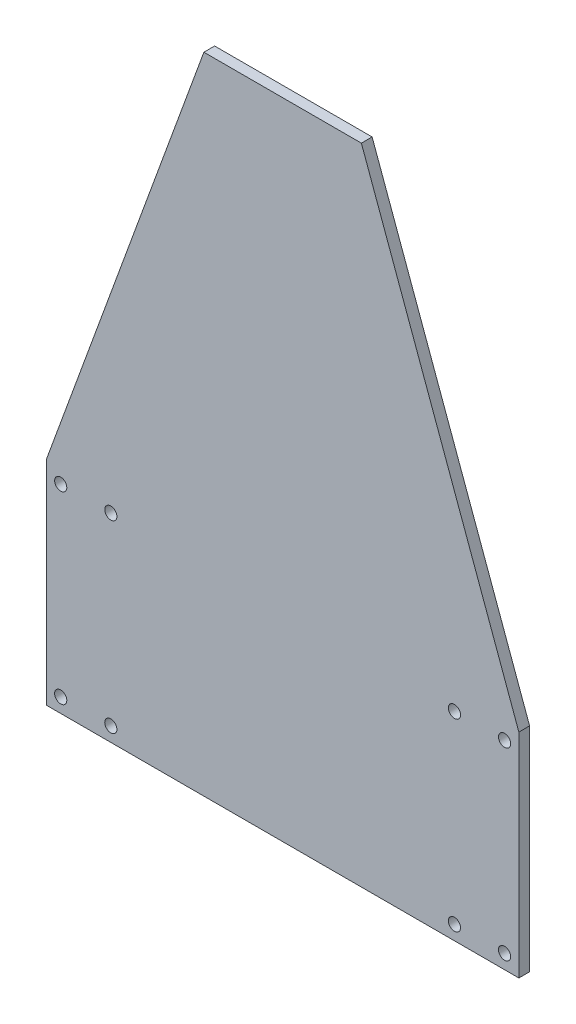
ISO-10303-21;
HEADER;
FILE_DESCRIPTION(('STEP AP214'),'2;1');
FILE_NAME('part.step','',(''),(''),'','','');
FILE_SCHEMA(('AUTOMOTIVE_DESIGN { 1 0 10303 214 1 1 1 1 }'));
ENDSEC;
DATA;
#1=APPLICATION_CONTEXT('core data for automotive mechanical design processes');
#2=APPLICATION_PROTOCOL_DEFINITION('international standard','automotive_design',2000,#1);
#3=PRODUCT_CONTEXT('',#1,'mechanical');
#4=PRODUCT('Part','Part','',(#3));
#5=PRODUCT_RELATED_PRODUCT_CATEGORY('part','',(#4));
#6=PRODUCT_DEFINITION_FORMATION('','',#4);
#7=PRODUCT_DEFINITION_CONTEXT('part definition',#1,'design');
#8=PRODUCT_DEFINITION('design','',#6,#7);
#9=PRODUCT_DEFINITION_SHAPE('','',#8);
#10=(LENGTH_UNIT() NAMED_UNIT(*) SI_UNIT(.MILLI.,.METRE.));
#11=(NAMED_UNIT(*) PLANE_ANGLE_UNIT() SI_UNIT($,.RADIAN.));
#12=(NAMED_UNIT(*) SI_UNIT($,.STERADIAN.) SOLID_ANGLE_UNIT());
#13=UNCERTAINTY_MEASURE_WITH_UNIT(LENGTH_MEASURE(1.E-05),#10,'distance_accuracy_value','');
#14=(GEOMETRIC_REPRESENTATION_CONTEXT(3) GLOBAL_UNCERTAINTY_ASSIGNED_CONTEXT((#13)) GLOBAL_UNIT_ASSIGNED_CONTEXT((#10,
#11,#12)) REPRESENTATION_CONTEXT('',''));
#15=CARTESIAN_POINT('',(0.,0.,0.));
#16=DIRECTION('',(0.,0.,1.));
#17=DIRECTION('',(1.,0.,0.));
#18=AXIS2_PLACEMENT_3D('',#15,#16,#17);
#19=CARTESIAN_POINT('',(66.,0.,3.));
#20=DIRECTION('',(0.,1.,0.));
#21=DIRECTION('',(0.,0.,1.));
#22=AXIS2_PLACEMENT_3D('',#19,#20,#21);
#23=PLANE('',#22);
#24=DIRECTION('',(1.,0.,0.));
#25=VECTOR('',#24,1.);
#26=CARTESIAN_POINT('',(66.,0.,0.));
#27=LINE('',#26,#25);
#28=CARTESIAN_POINT('',(-66.,0.,0.));
#29=VERTEX_POINT('',#28);
#30=CARTESIAN_POINT('',(66.,0.,0.));
#31=VERTEX_POINT('',#30);
#32=EDGE_CURVE('E142',#29,#31,#27,.T.);
#33=ORIENTED_EDGE('',*,*,#32,.T.);
#34=DIRECTION('',(0.,0.,-1.));
#35=VECTOR('',#34,1.);
#36=CARTESIAN_POINT('',(66.,0.,3.));
#37=LINE('',#36,#35);
#38=CARTESIAN_POINT('',(66.,0.,3.));
#39=VERTEX_POINT('',#38);
#40=EDGE_CURVE('E11',#39,#31,#37,.T.);
#41=ORIENTED_EDGE('',*,*,#40,.F.);
#42=DIRECTION('',(1.,0.,0.));
#43=VECTOR('',#42,1.);
#44=CARTESIAN_POINT('',(66.,0.,3.));
#45=LINE('',#44,#43);
#46=CARTESIAN_POINT('',(-66.,0.,3.));
#47=VERTEX_POINT('',#46);
#48=EDGE_CURVE('E73',#47,#39,#45,.T.);
#49=ORIENTED_EDGE('',*,*,#48,.F.);
#50=DIRECTION('',(0.,0.,-1.));
#51=VECTOR('',#50,1.);
#52=CARTESIAN_POINT('',(-66.,0.,3.));
#53=LINE('',#52,#51);
#54=EDGE_CURVE('E93',#47,#29,#53,.T.);
#55=ORIENTED_EDGE('',*,*,#54,.T.);
#56=EDGE_LOOP('',(#33,#41,#49,#55));
#57=FACE_BOUND('',#56,.T.);
#58=ADVANCED_FACE('F33',(#57),#23,.F.);
#59=CARTESIAN_POINT('',(66.,59.5,3.));
#60=DIRECTION('',(-1.,0.,0.));
#61=DIRECTION('',(0.,0.,1.));
#62=AXIS2_PLACEMENT_3D('',#59,#60,#61);
#63=PLANE('',#62);
#64=DIRECTION('',(0.,1.,0.));
#65=VECTOR('',#64,1.);
#66=CARTESIAN_POINT('',(66.,59.5,0.));
#67=LINE('',#66,#65);
#68=CARTESIAN_POINT('',(66.,59.5,0.));
#69=VERTEX_POINT('',#68);
#70=EDGE_CURVE('E63',#31,#69,#67,.T.);
#71=ORIENTED_EDGE('',*,*,#70,.T.);
#72=DIRECTION('',(0.,0.,-1.));
#73=VECTOR('',#72,1.);
#74=CARTESIAN_POINT('',(66.,59.5,3.));
#75=LINE('',#74,#73);
#76=CARTESIAN_POINT('',(66.,59.5,3.));
#77=VERTEX_POINT('',#76);
#78=EDGE_CURVE('E41',#77,#69,#75,.T.);
#79=ORIENTED_EDGE('',*,*,#78,.F.);
#80=DIRECTION('',(0.,1.,0.));
#81=VECTOR('',#80,1.);
#82=CARTESIAN_POINT('',(66.,59.5,3.));
#83=LINE('',#82,#81);
#84=EDGE_CURVE('E95',#39,#77,#83,.T.);
#85=ORIENTED_EDGE('',*,*,#84,.F.);
#86=ORIENTED_EDGE('',*,*,#40,.T.);
#87=EDGE_LOOP('',(#71,#79,#85,#86));
#88=FACE_BOUND('',#87,.T.);
#89=ADVANCED_FACE('F208',(#88),#63,.F.);
#90=CARTESIAN_POINT('',(22.,180.,3.));
#91=DIRECTION('',(-0.939337387974437,-0.342994564903529,0.));
#92=DIRECTION('',(0.342994564903529,-0.939337387974437,0.));
#93=AXIS2_PLACEMENT_3D('',#90,#91,#92);
#94=PLANE('',#93);
#95=DIRECTION('',(-0.342994564903529,0.939337387974438,0.));
#96=VECTOR('',#95,1.);
#97=CARTESIAN_POINT('',(22.,180.,0.));
#98=LINE('',#97,#96);
#99=CARTESIAN_POINT('',(22.,180.,0.));
#100=VERTEX_POINT('',#99);
#101=EDGE_CURVE('E68',#69,#100,#98,.T.);
#102=ORIENTED_EDGE('',*,*,#101,.T.);
#103=DIRECTION('',(0.,0.,-1.));
#104=VECTOR('',#103,1.);
#105=CARTESIAN_POINT('',(22.,180.,3.));
#106=LINE('',#105,#104);
#107=CARTESIAN_POINT('',(22.,180.,3.));
#108=VERTEX_POINT('',#107);
#109=EDGE_CURVE('E148',#108,#100,#106,.T.);
#110=ORIENTED_EDGE('',*,*,#109,.F.);
#111=DIRECTION('',(-0.342994564903529,0.939337387974438,0.));
#112=VECTOR('',#111,1.);
#113=CARTESIAN_POINT('',(22.,180.,3.));
#114=LINE('',#113,#112);
#115=EDGE_CURVE('E49',#77,#108,#114,.T.);
#116=ORIENTED_EDGE('',*,*,#115,.F.);
#117=ORIENTED_EDGE('',*,*,#78,.T.);
#118=EDGE_LOOP('',(#102,#110,#116,#117));
#119=FACE_BOUND('',#118,.T.);
#120=ADVANCED_FACE('F153',(#119),#94,.F.);
#121=CARTESIAN_POINT('',(0.,180.,3.));
#122=DIRECTION('',(0.,-1.,0.));
#123=DIRECTION('',(0.,0.,-1.));
#124=AXIS2_PLACEMENT_3D('',#121,#122,#123);
#125=PLANE('',#124);
#126=DIRECTION('',(-1.,0.,0.));
#127=VECTOR('',#126,1.);
#128=CARTESIAN_POINT('',(0.,180.,0.));
#129=LINE('',#128,#127);
#130=CARTESIAN_POINT('',(-22.,180.,0.));
#131=VERTEX_POINT('',#130);
#132=EDGE_CURVE('E96',#100,#131,#129,.T.);
#133=ORIENTED_EDGE('',*,*,#132,.T.);
#134=DIRECTION('',(0.,0.,-1.));
#135=VECTOR('',#134,1.);
#136=CARTESIAN_POINT('',(-22.,180.,3.));
#137=LINE('',#136,#135);
#138=CARTESIAN_POINT('',(-22.,180.,3.));
#139=VERTEX_POINT('',#138);
#140=EDGE_CURVE('E119',#139,#131,#137,.T.);
#141=ORIENTED_EDGE('',*,*,#140,.F.);
#142=DIRECTION('',(-1.,0.,0.));
#143=VECTOR('',#142,1.);
#144=CARTESIAN_POINT('',(0.,180.,3.));
#145=LINE('',#144,#143);
#146=EDGE_CURVE('E146',#108,#139,#145,.T.);
#147=ORIENTED_EDGE('',*,*,#146,.F.);
#148=ORIENTED_EDGE('',*,*,#109,.T.);
#149=EDGE_LOOP('',(#133,#141,#147,#148));
#150=FACE_BOUND('',#149,.T.);
#151=ADVANCED_FACE('F162',(#150),#125,.F.);
#152=CARTESIAN_POINT('',(0.,0.,3.));
#153=DIRECTION('',(0.,0.,-1.));
#154=DIRECTION('',(-1.,0.,0.));
#155=AXIS2_PLACEMENT_3D('',#152,#153,#154);
#156=PLANE('',#155);
#157=CARTESIAN_POINT('',(48.,55.5,3.));
#158=DIRECTION('',(0.,0.,1.));
#159=DIRECTION('',(1.,0.,0.));
#160=AXIS2_PLACEMENT_3D('',#157,#158,#159);
#161=CIRCLE('',#160,1.69999999999999);
#162=CARTESIAN_POINT('',(49.7,55.5,3.));
#163=VERTEX_POINT('',#162);
#164=EDGE_CURVE('E113',#163,#163,#161,.T.);
#165=ORIENTED_EDGE('',*,*,#164,.F.);
#166=EDGE_LOOP('',(#165));
#167=FACE_BOUND('',#166,.T.);
#168=CARTESIAN_POINT('',(62.,55.5,3.));
#169=DIRECTION('',(0.,0.,1.));
#170=DIRECTION('',(1.,0.,0.));
#171=AXIS2_PLACEMENT_3D('',#168,#169,#170);
#172=CIRCLE('',#171,1.69999999999999);
#173=CARTESIAN_POINT('',(63.7,55.5,3.));
#174=VERTEX_POINT('',#173);
#175=EDGE_CURVE('E125',#174,#174,#172,.T.);
#176=ORIENTED_EDGE('',*,*,#175,.F.);
#177=EDGE_LOOP('',(#176));
#178=FACE_BOUND('',#177,.T.);
#179=CARTESIAN_POINT('',(48.,4.,3.));
#180=DIRECTION('',(0.,0.,1.));
#181=DIRECTION('',(1.,0.,0.));
#182=AXIS2_PLACEMENT_3D('',#179,#180,#181);
#183=CIRCLE('',#182,1.69999999999999);
#184=CARTESIAN_POINT('',(49.7,4.,3.));
#185=VERTEX_POINT('',#184);
#186=EDGE_CURVE('E131',#185,#185,#183,.T.);
#187=ORIENTED_EDGE('',*,*,#186,.F.);
#188=EDGE_LOOP('',(#187));
#189=FACE_BOUND('',#188,.T.);
#190=CARTESIAN_POINT('',(62.,4.,3.));
#191=DIRECTION('',(0.,0.,1.));
#192=DIRECTION('',(1.,0.,0.));
#193=AXIS2_PLACEMENT_3D('',#190,#191,#192);
#194=CIRCLE('',#193,1.69999999999999);
#195=CARTESIAN_POINT('',(63.7,4.,3.));
#196=VERTEX_POINT('',#195);
#197=EDGE_CURVE('E137',#196,#196,#194,.T.);
#198=ORIENTED_EDGE('',*,*,#197,.F.);
#199=EDGE_LOOP('',(#198));
#200=FACE_BOUND('',#199,.T.);
#201=ORIENTED_EDGE('',*,*,#146,.T.);
#202=DIRECTION('',(0.342994564903529,0.939337387974438,0.));
#203=VECTOR('',#202,1.);
#204=CARTESIAN_POINT('',(-22.,180.,3.));
#205=LINE('',#204,#203);
#206=CARTESIAN_POINT('',(-66.,59.5,3.));
#207=VERTEX_POINT('',#206);
#208=EDGE_CURVE('E103',#207,#139,#205,.T.);
#209=ORIENTED_EDGE('',*,*,#208,.F.);
#210=DIRECTION('',(0.,1.,0.));
#211=VECTOR('',#210,1.);
#212=CARTESIAN_POINT('',(-66.,59.5,3.));
#213=LINE('',#212,#211);
#214=EDGE_CURVE('E99',#47,#207,#213,.T.);
#215=ORIENTED_EDGE('',*,*,#214,.F.);
#216=ORIENTED_EDGE('',*,*,#48,.T.);
#217=ORIENTED_EDGE('',*,*,#84,.T.);
#218=ORIENTED_EDGE('',*,*,#115,.T.);
#219=EDGE_LOOP('',(#201,#209,#215,#216,#217,#218));
#220=FACE_BOUND('',#219,.T.);
#221=CARTESIAN_POINT('',(-48.,55.5,3.));
#222=DIRECTION('',(0.,0.,-1.));
#223=DIRECTION('',(-1.,0.,0.));
#224=AXIS2_PLACEMENT_3D('',#221,#222,#223);
#225=CIRCLE('',#224,1.69999999999999);
#226=CARTESIAN_POINT('',(-49.7,55.5,3.));
#227=VERTEX_POINT('',#226);
#228=EDGE_CURVE('E191',#227,#227,#225,.T.);
#229=ORIENTED_EDGE('',*,*,#228,.T.);
#230=EDGE_LOOP('',(#229));
#231=FACE_BOUND('',#230,.T.);
#232=CARTESIAN_POINT('',(-62.,55.5,3.));
#233=DIRECTION('',(0.,0.,-1.));
#234=DIRECTION('',(-1.,0.,0.));
#235=AXIS2_PLACEMENT_3D('',#232,#233,#234);
#236=CIRCLE('',#235,1.69999999999999);
#237=CARTESIAN_POINT('',(-63.7,55.5,3.));
#238=VERTEX_POINT('',#237);
#239=EDGE_CURVE('E185',#238,#238,#236,.T.);
#240=ORIENTED_EDGE('',*,*,#239,.T.);
#241=EDGE_LOOP('',(#240));
#242=FACE_BOUND('',#241,.T.);
#243=CARTESIAN_POINT('',(-48.,4.,3.));
#244=DIRECTION('',(0.,0.,-1.));
#245=DIRECTION('',(-1.,0.,0.));
#246=AXIS2_PLACEMENT_3D('',#243,#244,#245);
#247=CIRCLE('',#246,1.69999999999999);
#248=CARTESIAN_POINT('',(-49.7,4.,3.));
#249=VERTEX_POINT('',#248);
#250=EDGE_CURVE('E179',#249,#249,#247,.T.);
#251=ORIENTED_EDGE('',*,*,#250,.T.);
#252=EDGE_LOOP('',(#251));
#253=FACE_BOUND('',#252,.T.);
#254=CARTESIAN_POINT('',(-62.,4.,3.));
#255=DIRECTION('',(0.,0.,-1.));
#256=DIRECTION('',(-1.,0.,0.));
#257=AXIS2_PLACEMENT_3D('',#254,#255,#256);
#258=CIRCLE('',#257,1.69999999999999);
#259=CARTESIAN_POINT('',(-63.7,4.,3.));
#260=VERTEX_POINT('',#259);
#261=EDGE_CURVE('E173',#260,#260,#258,.T.);
#262=ORIENTED_EDGE('',*,*,#261,.T.);
#263=EDGE_LOOP('',(#262));
#264=FACE_BOUND('',#263,.T.);
#265=ADVANCED_FACE('F100',(#167,#178,#189,#200,#220,#231,#242,#253,#264),#156,.F.);
#266=CARTESIAN_POINT('',(0.,0.,0.));
#267=DIRECTION('',(0.,0.,-1.));
#268=DIRECTION('',(-1.,0.,0.));
#269=AXIS2_PLACEMENT_3D('',#266,#267,#268);
#270=PLANE('',#269);
#271=CARTESIAN_POINT('',(48.,55.5,0.));
#272=DIRECTION('',(0.,0.,1.));
#273=DIRECTION('',(1.,0.,0.));
#274=AXIS2_PLACEMENT_3D('',#271,#272,#273);
#275=CIRCLE('',#274,1.7);
#276=CARTESIAN_POINT('',(49.7,55.5,0.));
#277=VERTEX_POINT('',#276);
#278=EDGE_CURVE('E117',#277,#277,#275,.T.);
#279=ORIENTED_EDGE('',*,*,#278,.T.);
#280=EDGE_LOOP('',(#279));
#281=FACE_BOUND('',#280,.T.);
#282=CARTESIAN_POINT('',(62.,55.5,0.));
#283=DIRECTION('',(0.,0.,1.));
#284=DIRECTION('',(1.,0.,0.));
#285=AXIS2_PLACEMENT_3D('',#282,#283,#284);
#286=CIRCLE('',#285,1.69999999999999);
#287=CARTESIAN_POINT('',(63.7,55.5,0.));
#288=VERTEX_POINT('',#287);
#289=EDGE_CURVE('E128',#288,#288,#286,.T.);
#290=ORIENTED_EDGE('',*,*,#289,.T.);
#291=EDGE_LOOP('',(#290));
#292=FACE_BOUND('',#291,.T.);
#293=CARTESIAN_POINT('',(48.,4.,0.));
#294=DIRECTION('',(0.,0.,1.));
#295=DIRECTION('',(1.,0.,0.));
#296=AXIS2_PLACEMENT_3D('',#293,#294,#295);
#297=CIRCLE('',#296,1.7);
#298=CARTESIAN_POINT('',(49.7,4.,0.));
#299=VERTEX_POINT('',#298);
#300=EDGE_CURVE('E134',#299,#299,#297,.T.);
#301=ORIENTED_EDGE('',*,*,#300,.T.);
#302=EDGE_LOOP('',(#301));
#303=FACE_BOUND('',#302,.T.);
#304=CARTESIAN_POINT('',(62.,4.,0.));
#305=DIRECTION('',(0.,0.,1.));
#306=DIRECTION('',(1.,0.,0.));
#307=AXIS2_PLACEMENT_3D('',#304,#305,#306);
#308=CIRCLE('',#307,1.69999999999999);
#309=CARTESIAN_POINT('',(63.7,4.,0.));
#310=VERTEX_POINT('',#309);
#311=EDGE_CURVE('E140',#310,#310,#308,.T.);
#312=ORIENTED_EDGE('',*,*,#311,.T.);
#313=EDGE_LOOP('',(#312));
#314=FACE_BOUND('',#313,.T.);
#315=ORIENTED_EDGE('',*,*,#32,.F.);
#316=DIRECTION('',(0.,1.,0.));
#317=VECTOR('',#316,1.);
#318=CARTESIAN_POINT('',(-66.,59.5,0.));
#319=LINE('',#318,#317);
#320=CARTESIAN_POINT('',(-66.,59.5,0.));
#321=VERTEX_POINT('',#320);
#322=EDGE_CURVE('E112',#29,#321,#319,.T.);
#323=ORIENTED_EDGE('',*,*,#322,.T.);
#324=DIRECTION('',(0.342994564903529,0.939337387974438,0.));
#325=VECTOR('',#324,1.);
#326=CARTESIAN_POINT('',(-22.,180.,0.));
#327=LINE('',#326,#325);
#328=EDGE_CURVE('E107',#321,#131,#327,.T.);
#329=ORIENTED_EDGE('',*,*,#328,.T.);
#330=ORIENTED_EDGE('',*,*,#132,.F.);
#331=ORIENTED_EDGE('',*,*,#101,.F.);
#332=ORIENTED_EDGE('',*,*,#70,.F.);
#333=EDGE_LOOP('',(#315,#323,#329,#330,#331,#332));
#334=FACE_BOUND('',#333,.T.);
#335=CARTESIAN_POINT('',(-48.,55.5,0.));
#336=DIRECTION('',(0.,0.,-1.));
#337=DIRECTION('',(-1.,0.,0.));
#338=AXIS2_PLACEMENT_3D('',#335,#336,#337);
#339=CIRCLE('',#338,1.7);
#340=CARTESIAN_POINT('',(-49.7,55.5,0.));
#341=VERTEX_POINT('',#340);
#342=EDGE_CURVE('E188',#341,#341,#339,.T.);
#343=ORIENTED_EDGE('',*,*,#342,.F.);
#344=EDGE_LOOP('',(#343));
#345=FACE_BOUND('',#344,.T.);
#346=CARTESIAN_POINT('',(-62.,55.5,0.));
#347=DIRECTION('',(0.,0.,-1.));
#348=DIRECTION('',(-1.,0.,0.));
#349=AXIS2_PLACEMENT_3D('',#346,#347,#348);
#350=CIRCLE('',#349,1.69999999999999);
#351=CARTESIAN_POINT('',(-63.7,55.5,0.));
#352=VERTEX_POINT('',#351);
#353=EDGE_CURVE('E182',#352,#352,#350,.T.);
#354=ORIENTED_EDGE('',*,*,#353,.F.);
#355=EDGE_LOOP('',(#354));
#356=FACE_BOUND('',#355,.T.);
#357=CARTESIAN_POINT('',(-48.,4.,0.));
#358=DIRECTION('',(0.,0.,-1.));
#359=DIRECTION('',(-1.,0.,0.));
#360=AXIS2_PLACEMENT_3D('',#357,#358,#359);
#361=CIRCLE('',#360,1.7);
#362=CARTESIAN_POINT('',(-49.7,4.,0.));
#363=VERTEX_POINT('',#362);
#364=EDGE_CURVE('E176',#363,#363,#361,.T.);
#365=ORIENTED_EDGE('',*,*,#364,.F.);
#366=EDGE_LOOP('',(#365));
#367=FACE_BOUND('',#366,.T.);
#368=CARTESIAN_POINT('',(-62.,4.,0.));
#369=DIRECTION('',(0.,0.,-1.));
#370=DIRECTION('',(-1.,0.,0.));
#371=AXIS2_PLACEMENT_3D('',#368,#369,#370);
#372=CIRCLE('',#371,1.69999999999999);
#373=CARTESIAN_POINT('',(-63.7,4.,0.));
#374=VERTEX_POINT('',#373);
#375=EDGE_CURVE('E169',#374,#374,#372,.T.);
#376=ORIENTED_EDGE('',*,*,#375,.F.);
#377=EDGE_LOOP('',(#376));
#378=FACE_BOUND('',#377,.T.);
#379=ADVANCED_FACE('F156',(#281,#292,#303,#314,#334,#345,#356,#367,#378),#270,.T.);
#380=CARTESIAN_POINT('',(62.,4.,3.));
#381=DIRECTION('',(0.,0.,1.));
#382=DIRECTION('',(1.,0.,0.));
#383=AXIS2_PLACEMENT_3D('',#380,#381,#382);
#384=CYLINDRICAL_SURFACE('',#383,1.69999999999999);
#385=ORIENTED_EDGE('',*,*,#311,.F.);
#386=EDGE_LOOP('',(#385));
#387=FACE_BOUND('',#386,.T.);
#388=ORIENTED_EDGE('',*,*,#197,.T.);
#389=EDGE_LOOP('',(#388));
#390=FACE_BOUND('',#389,.T.);
#391=ADVANCED_FACE('F222',(#387,#390),#384,.F.);
#392=CARTESIAN_POINT('',(48.,4.,3.));
#393=DIRECTION('',(0.,0.,1.));
#394=DIRECTION('',(1.,0.,0.));
#395=AXIS2_PLACEMENT_3D('',#392,#393,#394);
#396=CYLINDRICAL_SURFACE('',#395,1.69999999999999);
#397=ORIENTED_EDGE('',*,*,#300,.F.);
#398=EDGE_LOOP('',(#397));
#399=FACE_BOUND('',#398,.T.);
#400=ORIENTED_EDGE('',*,*,#186,.T.);
#401=EDGE_LOOP('',(#400));
#402=FACE_BOUND('',#401,.T.);
#403=ADVANCED_FACE('F229',(#399,#402),#396,.F.);
#404=CARTESIAN_POINT('',(62.,55.5,3.));
#405=DIRECTION('',(0.,0.,1.));
#406=DIRECTION('',(1.,0.,0.));
#407=AXIS2_PLACEMENT_3D('',#404,#405,#406);
#408=CYLINDRICAL_SURFACE('',#407,1.69999999999999);
#409=ORIENTED_EDGE('',*,*,#289,.F.);
#410=EDGE_LOOP('',(#409));
#411=FACE_BOUND('',#410,.T.);
#412=ORIENTED_EDGE('',*,*,#175,.T.);
#413=EDGE_LOOP('',(#412));
#414=FACE_BOUND('',#413,.T.);
#415=ADVANCED_FACE('F233',(#411,#414),#408,.F.);
#416=CARTESIAN_POINT('',(48.,55.5,3.));
#417=DIRECTION('',(0.,0.,1.));
#418=DIRECTION('',(1.,0.,0.));
#419=AXIS2_PLACEMENT_3D('',#416,#417,#418);
#420=CYLINDRICAL_SURFACE('',#419,1.69999999999999);
#421=ORIENTED_EDGE('',*,*,#278,.F.);
#422=EDGE_LOOP('',(#421));
#423=FACE_BOUND('',#422,.T.);
#424=ORIENTED_EDGE('',*,*,#164,.T.);
#425=EDGE_LOOP('',(#424));
#426=FACE_BOUND('',#425,.T.);
#427=ADVANCED_FACE('F237',(#423,#426),#420,.F.);
#428=CARTESIAN_POINT('',(-66.,59.5,3.));
#429=DIRECTION('',(1.,0.,0.));
#430=DIRECTION('',(0.,0.,1.));
#431=AXIS2_PLACEMENT_3D('',#428,#429,#430);
#432=PLANE('',#431);
#433=ORIENTED_EDGE('',*,*,#322,.F.);
#434=ORIENTED_EDGE('',*,*,#54,.F.);
#435=ORIENTED_EDGE('',*,*,#214,.T.);
#436=DIRECTION('',(0.,0.,-1.));
#437=VECTOR('',#436,1.);
#438=CARTESIAN_POINT('',(-66.,59.5,3.));
#439=LINE('',#438,#437);
#440=EDGE_CURVE('E114',#207,#321,#439,.T.);
#441=ORIENTED_EDGE('',*,*,#440,.T.);
#442=EDGE_LOOP('',(#433,#434,#435,#441));
#443=FACE_BOUND('',#442,.T.);
#444=ADVANCED_FACE('F110',(#443),#432,.F.);
#445=CARTESIAN_POINT('',(-22.,180.,3.));
#446=DIRECTION('',(0.939337387974437,-0.342994564903529,0.));
#447=DIRECTION('',(-0.342994564903529,-0.939337387974437,0.));
#448=AXIS2_PLACEMENT_3D('',#445,#446,#447);
#449=PLANE('',#448);
#450=ORIENTED_EDGE('',*,*,#328,.F.);
#451=ORIENTED_EDGE('',*,*,#440,.F.);
#452=ORIENTED_EDGE('',*,*,#208,.T.);
#453=ORIENTED_EDGE('',*,*,#140,.T.);
#454=EDGE_LOOP('',(#450,#451,#452,#453));
#455=FACE_BOUND('',#454,.T.);
#456=ADVANCED_FACE('F165',(#455),#449,.F.);
#457=CARTESIAN_POINT('',(-62.,4.,3.));
#458=DIRECTION('',(0.,0.,1.));
#459=DIRECTION('',(-1.,0.,0.));
#460=AXIS2_PLACEMENT_3D('',#457,#458,#459);
#461=CYLINDRICAL_SURFACE('',#460,1.69999999999999);
#462=ORIENTED_EDGE('',*,*,#375,.T.);
#463=EDGE_LOOP('',(#462));
#464=FACE_BOUND('',#463,.T.);
#465=ORIENTED_EDGE('',*,*,#261,.F.);
#466=EDGE_LOOP('',(#465));
#467=FACE_BOUND('',#466,.T.);
#468=ADVANCED_FACE('F246',(#464,#467),#461,.F.);
#469=CARTESIAN_POINT('',(-48.,4.,3.));
#470=DIRECTION('',(0.,0.,1.));
#471=DIRECTION('',(-1.,0.,0.));
#472=AXIS2_PLACEMENT_3D('',#469,#470,#471);
#473=CYLINDRICAL_SURFACE('',#472,1.69999999999999);
#474=ORIENTED_EDGE('',*,*,#364,.T.);
#475=EDGE_LOOP('',(#474));
#476=FACE_BOUND('',#475,.T.);
#477=ORIENTED_EDGE('',*,*,#250,.F.);
#478=EDGE_LOOP('',(#477));
#479=FACE_BOUND('',#478,.T.);
#480=ADVANCED_FACE('F204',(#476,#479),#473,.F.);
#481=CARTESIAN_POINT('',(-62.,55.5,3.));
#482=DIRECTION('',(0.,0.,1.));
#483=DIRECTION('',(-1.,0.,0.));
#484=AXIS2_PLACEMENT_3D('',#481,#482,#483);
#485=CYLINDRICAL_SURFACE('',#484,1.69999999999999);
#486=ORIENTED_EDGE('',*,*,#353,.T.);
#487=EDGE_LOOP('',(#486));
#488=FACE_BOUND('',#487,.T.);
#489=ORIENTED_EDGE('',*,*,#239,.F.);
#490=EDGE_LOOP('',(#489));
#491=FACE_BOUND('',#490,.T.);
#492=ADVANCED_FACE('F198',(#488,#491),#485,.F.);
#493=CARTESIAN_POINT('',(-48.,55.5,3.));
#494=DIRECTION('',(0.,0.,1.));
#495=DIRECTION('',(-1.,0.,0.));
#496=AXIS2_PLACEMENT_3D('',#493,#494,#495);
#497=CYLINDRICAL_SURFACE('',#496,1.69999999999999);
#498=ORIENTED_EDGE('',*,*,#342,.T.);
#499=EDGE_LOOP('',(#498));
#500=FACE_BOUND('',#499,.T.);
#501=ORIENTED_EDGE('',*,*,#228,.F.);
#502=EDGE_LOOP('',(#501));
#503=FACE_BOUND('',#502,.T.);
#504=ADVANCED_FACE('F196',(#500,#503),#497,.F.);
#505=CLOSED_SHELL('',(#58,#89,#120,#151,#265,#379,#391,#403,#415,#427,#444,#456,#468,#480,#492,#504));
#506=MANIFOLD_SOLID_BREP('B2',#505);
#507=ADVANCED_BREP_SHAPE_REPRESENTATION('',(#18,#506),#14);
#508=SHAPE_DEFINITION_REPRESENTATION(#9,#507);
ENDSEC;
END-ISO-10303-21;
